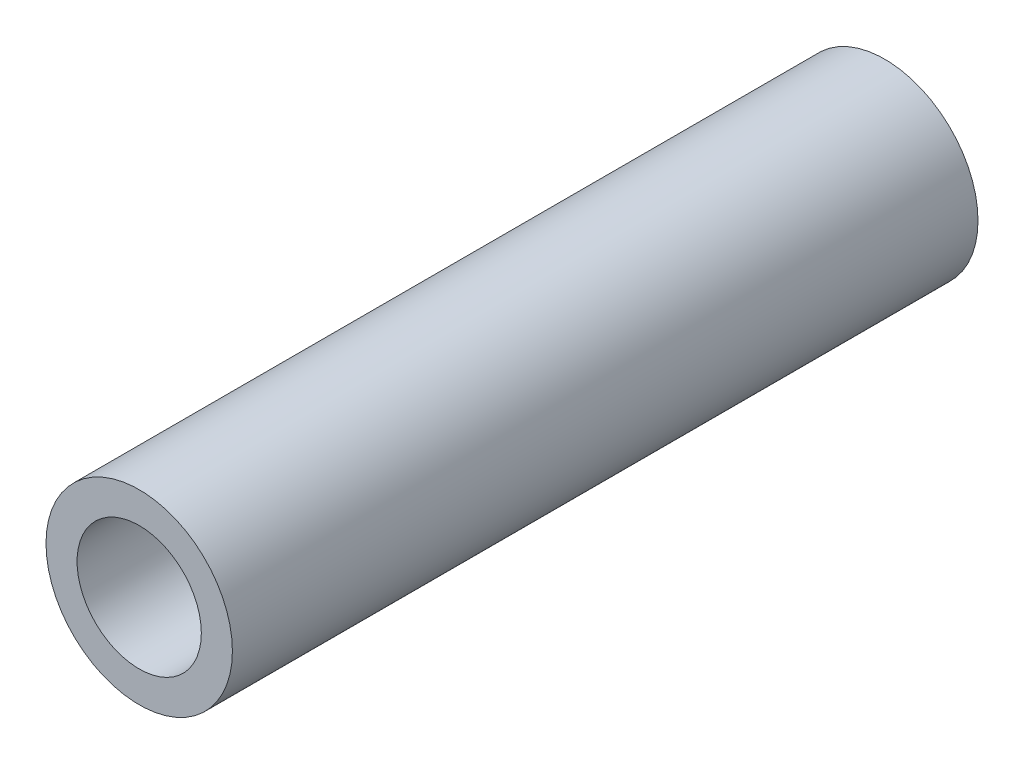
ISO-10303-21;
HEADER;
FILE_DESCRIPTION(('STEP AP214'),'2;1');
FILE_NAME('part.step','',(''),(''),'','','');
FILE_SCHEMA(('AUTOMOTIVE_DESIGN { 1 0 10303 214 1 1 1 1 }'));
ENDSEC;
DATA;
#1=APPLICATION_CONTEXT('core data for automotive mechanical design processes');
#2=APPLICATION_PROTOCOL_DEFINITION('international standard','automotive_design',2000,#1);
#3=PRODUCT_CONTEXT('',#1,'mechanical');
#4=PRODUCT('Part','Part','',(#3));
#5=PRODUCT_RELATED_PRODUCT_CATEGORY('part','',(#4));
#6=PRODUCT_DEFINITION_FORMATION('','',#4);
#7=PRODUCT_DEFINITION_CONTEXT('part definition',#1,'design');
#8=PRODUCT_DEFINITION('design','',#6,#7);
#9=PRODUCT_DEFINITION_SHAPE('','',#8);
#10=(LENGTH_UNIT() NAMED_UNIT(*) SI_UNIT(.MILLI.,.METRE.));
#11=(NAMED_UNIT(*) PLANE_ANGLE_UNIT() SI_UNIT($,.RADIAN.));
#12=(NAMED_UNIT(*) SI_UNIT($,.STERADIAN.) SOLID_ANGLE_UNIT());
#13=UNCERTAINTY_MEASURE_WITH_UNIT(LENGTH_MEASURE(1.E-05),#10,'distance_accuracy_value','');
#14=(GEOMETRIC_REPRESENTATION_CONTEXT(3) GLOBAL_UNCERTAINTY_ASSIGNED_CONTEXT((#13)) GLOBAL_UNIT_ASSIGNED_CONTEXT((#10,
#11,#12)) REPRESENTATION_CONTEXT('',''));
#15=CARTESIAN_POINT('',(0.,0.,0.));
#16=DIRECTION('',(0.,0.,1.));
#17=DIRECTION('',(1.,0.,0.));
#18=AXIS2_PLACEMENT_3D('',#15,#16,#17);
#19=CARTESIAN_POINT('',(0.,0.,-304.8));
#20=DIRECTION('',(0.,0.,1.));
#21=DIRECTION('',(1.,0.,0.));
#22=AXIS2_PLACEMENT_3D('',#19,#20,#21);
#23=CYLINDRICAL_SURFACE('',#22,38.1);
#24=CARTESIAN_POINT('',(0.,0.,-304.8));
#25=DIRECTION('',(0.,0.,1.));
#26=DIRECTION('',(1.,0.,0.));
#27=AXIS2_PLACEMENT_3D('',#24,#25,#26);
#28=CIRCLE('',#27,38.1);
#29=CARTESIAN_POINT('',(38.1,0.,-304.8));
#30=VERTEX_POINT('',#29);
#31=EDGE_CURVE('E10',#30,#30,#28,.T.);
#32=CARTESIAN_POINT('',(0.,0.,0.));
#33=DIRECTION('',(0.,0.,1.));
#34=DIRECTION('',(1.,0.,0.));
#35=AXIS2_PLACEMENT_3D('',#32,#33,#34);
#36=CIRCLE('',#35,38.1);
#37=CARTESIAN_POINT('',(38.1,0.,0.));
#38=VERTEX_POINT('',#37);
#39=EDGE_CURVE('E42',#38,#38,#36,.T.);
#40=CARTESIAN_POINT('',(38.1,0.,-304.8));
#41=CARTESIAN_POINT('',(38.1,0.,-301.625));
#42=CARTESIAN_POINT('',(38.1,0.,-298.45));
#43=CARTESIAN_POINT('',(38.1,0.,-292.1));
#44=CARTESIAN_POINT('',(38.1,0.,-288.925));
#45=CARTESIAN_POINT('',(38.1,0.,-282.575));
#46=CARTESIAN_POINT('',(38.1,0.,-279.4));
#47=CARTESIAN_POINT('',(38.1,0.,-273.05));
#48=CARTESIAN_POINT('',(38.1,0.,-269.875));
#49=CARTESIAN_POINT('',(38.1,0.,-263.525));
#50=CARTESIAN_POINT('',(38.1,0.,-260.35));
#51=CARTESIAN_POINT('',(38.1,0.,-254.));
#52=CARTESIAN_POINT('',(38.1,0.,-250.825));
#53=CARTESIAN_POINT('',(38.1,0.,-244.475));
#54=CARTESIAN_POINT('',(38.1,0.,-241.3));
#55=CARTESIAN_POINT('',(38.1,0.,-234.95));
#56=CARTESIAN_POINT('',(38.1,0.,-231.775));
#57=CARTESIAN_POINT('',(38.1,0.,-225.425));
#58=CARTESIAN_POINT('',(38.1,0.,-222.25));
#59=CARTESIAN_POINT('',(38.1,0.,-215.9));
#60=CARTESIAN_POINT('',(38.1,0.,-212.725));
#61=CARTESIAN_POINT('',(38.1,0.,-206.375));
#62=CARTESIAN_POINT('',(38.1,0.,-203.2));
#63=CARTESIAN_POINT('',(38.1,0.,-196.85));
#64=CARTESIAN_POINT('',(38.1,0.,-193.675));
#65=CARTESIAN_POINT('',(38.1,0.,-187.325));
#66=CARTESIAN_POINT('',(38.1,0.,-184.15));
#67=CARTESIAN_POINT('',(38.1,0.,-177.8));
#68=CARTESIAN_POINT('',(38.1,0.,-174.625));
#69=CARTESIAN_POINT('',(38.1,0.,-168.275));
#70=CARTESIAN_POINT('',(38.1,0.,-165.1));
#71=CARTESIAN_POINT('',(38.1,0.,-158.75));
#72=CARTESIAN_POINT('',(38.1,0.,-155.575));
#73=CARTESIAN_POINT('',(38.1,0.,-149.225));
#74=CARTESIAN_POINT('',(38.1,0.,-146.05));
#75=CARTESIAN_POINT('',(38.1,0.,-139.7));
#76=CARTESIAN_POINT('',(38.1,0.,-136.525));
#77=CARTESIAN_POINT('',(38.1,0.,-130.175));
#78=CARTESIAN_POINT('',(38.1,0.,-127.));
#79=CARTESIAN_POINT('',(38.1,0.,-120.65));
#80=CARTESIAN_POINT('',(38.1,0.,-117.475));
#81=CARTESIAN_POINT('',(38.1,0.,-111.125));
#82=CARTESIAN_POINT('',(38.1,0.,-107.95));
#83=CARTESIAN_POINT('',(38.1,0.,-101.6));
#84=CARTESIAN_POINT('',(38.1,0.,-98.425));
#85=CARTESIAN_POINT('',(38.1,0.,-92.075));
#86=CARTESIAN_POINT('',(38.1,0.,-88.9));
#87=CARTESIAN_POINT('',(38.1,0.,-82.55));
#88=CARTESIAN_POINT('',(38.1,0.,-79.375));
#89=CARTESIAN_POINT('',(38.1,0.,-73.025));
#90=CARTESIAN_POINT('',(38.1,0.,-69.85));
#91=CARTESIAN_POINT('',(38.1,0.,-63.5));
#92=CARTESIAN_POINT('',(38.1,0.,-60.325));
#93=CARTESIAN_POINT('',(38.1,0.,-53.975));
#94=CARTESIAN_POINT('',(38.1,0.,-50.8));
#95=CARTESIAN_POINT('',(38.1,0.,-44.45));
#96=CARTESIAN_POINT('',(38.1,0.,-41.275));
#97=CARTESIAN_POINT('',(38.1,0.,-34.925));
#98=CARTESIAN_POINT('',(38.1,0.,-31.75));
#99=CARTESIAN_POINT('',(38.1,0.,-25.4));
#100=CARTESIAN_POINT('',(38.1,0.,-22.225));
#101=CARTESIAN_POINT('',(38.1,0.,-15.875));
#102=CARTESIAN_POINT('',(38.1,0.,-12.7));
#103=CARTESIAN_POINT('',(38.1,0.,-6.35));
#104=CARTESIAN_POINT('',(38.1,0.,-3.175));
#105=CARTESIAN_POINT('',(38.1,0.,0.));
#106=B_SPLINE_CURVE_WITH_KNOTS('',3,(#40,#41,#42,#43,#44,#45,#46,#47,#48,#49,#50,#51,#52,#53,
#54,#55,#56,#57,#58,#59,#60,#61,#62,#63,#64,#65,#66,#67,#68,#69,#70,#71,#72,#73,#74,#75,#76,#77,
#78,#79,#80,#81,#82,#83,#84,#85,#86,#87,#88,#89,#90,#91,#92,#93,#94,#95,#96,#97,#98,#99,#100,
#101,#102,#103,#104,#105),.UNSPECIFIED.,.F.,.F.,(4,2,2,2,2,2,2,2,2,2,2,2,2,2,2,2,2,2,2,2,2,2,2,
2,2,2,2,2,2,2,2,2,4),(0.,9.52499999999995,19.05,28.575,38.1,47.625,57.15,66.675,76.2,85.725,
95.25,104.775,114.3,123.825,133.35,142.875,152.4,161.925,171.45,180.975,190.5,200.025,209.55,
219.075,228.6,238.125,247.65,257.175,266.7,276.225,285.75,295.275,304.8),.UNSPECIFIED.);
#107=EDGE_CURVE('BSEAM36',#30,#38,#106,.T.);
#108=ORIENTED_EDGE('',*,*,#31,.T.);
#109=ORIENTED_EDGE('',*,*,#39,.F.);
#110=ORIENTED_EDGE('',*,*,#107,.T.);
#111=ORIENTED_EDGE('',*,*,#107,.F.);
#112=EDGE_LOOP('',(#108,#110,#109,#111));
#113=FACE_BOUND('',#112,.T.);
#114=ADVANCED_FACE('F36',(#113),#23,.T.);
#115=CARTESIAN_POINT('',(0.,0.,-304.8));
#116=DIRECTION('',(0.,0.,1.));
#117=DIRECTION('',(1.,0.,0.));
#118=AXIS2_PLACEMENT_3D('',#115,#116,#117);
#119=PLANE('',#118);
#120=CARTESIAN_POINT('',(0.,0.,-304.8));
#121=DIRECTION('',(0.,0.,1.));
#122=DIRECTION('',(1.,0.,0.));
#123=AXIS2_PLACEMENT_3D('',#120,#121,#122);
#124=CIRCLE('',#123,25.4);
#125=CARTESIAN_POINT('',(25.4,0.,-304.8));
#126=VERTEX_POINT('',#125);
#127=EDGE_CURVE('E46',#126,#126,#124,.T.);
#128=ORIENTED_EDGE('',*,*,#127,.T.);
#129=EDGE_LOOP('',(#128));
#130=FACE_BOUND('',#129,.T.);
#131=ORIENTED_EDGE('',*,*,#31,.F.);
#132=EDGE_LOOP('',(#131));
#133=FACE_BOUND('',#132,.T.);
#134=ADVANCED_FACE('F60',(#130,#133),#119,.F.);
#135=CARTESIAN_POINT('',(0.,0.,0.));
#136=DIRECTION('',(0.,0.,1.));
#137=DIRECTION('',(1.,0.,0.));
#138=AXIS2_PLACEMENT_3D('',#135,#136,#137);
#139=PLANE('',#138);
#140=CARTESIAN_POINT('',(0.,0.,0.));
#141=DIRECTION('',(0.,0.,1.));
#142=DIRECTION('',(1.,0.,0.));
#143=AXIS2_PLACEMENT_3D('',#140,#141,#142);
#144=CIRCLE('',#143,25.4);
#145=CARTESIAN_POINT('',(25.4,0.,0.));
#146=VERTEX_POINT('',#145);
#147=EDGE_CURVE('E50',#146,#146,#144,.T.);
#148=ORIENTED_EDGE('',*,*,#147,.F.);
#149=EDGE_LOOP('',(#148));
#150=FACE_BOUND('',#149,.T.);
#151=ORIENTED_EDGE('',*,*,#39,.T.);
#152=EDGE_LOOP('',(#151));
#153=FACE_BOUND('',#152,.T.);
#154=ADVANCED_FACE('F58',(#150,#153),#139,.T.);
#155=CARTESIAN_POINT('',(0.,0.,-304.8));
#156=DIRECTION('',(0.,0.,1.));
#157=DIRECTION('',(1.,0.,0.));
#158=AXIS2_PLACEMENT_3D('',#155,#156,#157);
#159=CYLINDRICAL_SURFACE('',#158,25.4);
#160=CARTESIAN_POINT('',(25.4,0.,-304.8));
#161=CARTESIAN_POINT('',(25.4,0.,-301.625));
#162=CARTESIAN_POINT('',(25.4,0.,-298.45));
#163=CARTESIAN_POINT('',(25.4,0.,-292.1));
#164=CARTESIAN_POINT('',(25.4,0.,-288.925));
#165=CARTESIAN_POINT('',(25.4,0.,-282.575));
#166=CARTESIAN_POINT('',(25.4,0.,-279.4));
#167=CARTESIAN_POINT('',(25.4,0.,-273.05));
#168=CARTESIAN_POINT('',(25.4,0.,-269.875));
#169=CARTESIAN_POINT('',(25.4,0.,-263.525));
#170=CARTESIAN_POINT('',(25.4,0.,-260.35));
#171=CARTESIAN_POINT('',(25.4,0.,-254.));
#172=CARTESIAN_POINT('',(25.4,0.,-250.825));
#173=CARTESIAN_POINT('',(25.4,0.,-244.475));
#174=CARTESIAN_POINT('',(25.4,0.,-241.3));
#175=CARTESIAN_POINT('',(25.4,0.,-234.95));
#176=CARTESIAN_POINT('',(25.4,0.,-231.775));
#177=CARTESIAN_POINT('',(25.4,0.,-225.425));
#178=CARTESIAN_POINT('',(25.4,0.,-222.25));
#179=CARTESIAN_POINT('',(25.4,0.,-215.9));
#180=CARTESIAN_POINT('',(25.4,0.,-212.725));
#181=CARTESIAN_POINT('',(25.4,0.,-206.375));
#182=CARTESIAN_POINT('',(25.4,0.,-203.2));
#183=CARTESIAN_POINT('',(25.4,0.,-196.85));
#184=CARTESIAN_POINT('',(25.4,0.,-193.675));
#185=CARTESIAN_POINT('',(25.4,0.,-187.325));
#186=CARTESIAN_POINT('',(25.4,0.,-184.15));
#187=CARTESIAN_POINT('',(25.4,0.,-177.8));
#188=CARTESIAN_POINT('',(25.4,0.,-174.625));
#189=CARTESIAN_POINT('',(25.4,0.,-168.275));
#190=CARTESIAN_POINT('',(25.4,0.,-165.1));
#191=CARTESIAN_POINT('',(25.4,0.,-158.75));
#192=CARTESIAN_POINT('',(25.4,0.,-155.575));
#193=CARTESIAN_POINT('',(25.4,0.,-149.225));
#194=CARTESIAN_POINT('',(25.4,0.,-146.05));
#195=CARTESIAN_POINT('',(25.4,0.,-139.7));
#196=CARTESIAN_POINT('',(25.4,0.,-136.525));
#197=CARTESIAN_POINT('',(25.4,0.,-130.175));
#198=CARTESIAN_POINT('',(25.4,0.,-127.));
#199=CARTESIAN_POINT('',(25.4,0.,-120.65));
#200=CARTESIAN_POINT('',(25.4,0.,-117.475));
#201=CARTESIAN_POINT('',(25.4,0.,-111.125));
#202=CARTESIAN_POINT('',(25.4,0.,-107.95));
#203=CARTESIAN_POINT('',(25.4,0.,-101.6));
#204=CARTESIAN_POINT('',(25.4,0.,-98.425));
#205=CARTESIAN_POINT('',(25.4,0.,-92.075));
#206=CARTESIAN_POINT('',(25.4,0.,-88.9));
#207=CARTESIAN_POINT('',(25.4,0.,-82.55));
#208=CARTESIAN_POINT('',(25.4,0.,-79.375));
#209=CARTESIAN_POINT('',(25.4,0.,-73.025));
#210=CARTESIAN_POINT('',(25.4,0.,-69.85));
#211=CARTESIAN_POINT('',(25.4,0.,-63.5));
#212=CARTESIAN_POINT('',(25.4,0.,-60.325));
#213=CARTESIAN_POINT('',(25.4,0.,-53.975));
#214=CARTESIAN_POINT('',(25.4,0.,-50.8));
#215=CARTESIAN_POINT('',(25.4,0.,-44.45));
#216=CARTESIAN_POINT('',(25.4,0.,-41.275));
#217=CARTESIAN_POINT('',(25.4,0.,-34.925));
#218=CARTESIAN_POINT('',(25.4,0.,-31.75));
#219=CARTESIAN_POINT('',(25.4,0.,-25.4));
#220=CARTESIAN_POINT('',(25.4,0.,-22.225));
#221=CARTESIAN_POINT('',(25.4,0.,-15.875));
#222=CARTESIAN_POINT('',(25.4,0.,-12.7));
#223=CARTESIAN_POINT('',(25.4,0.,-6.35));
#224=CARTESIAN_POINT('',(25.4,0.,-3.175));
#225=CARTESIAN_POINT('',(25.4,0.,0.));
#226=B_SPLINE_CURVE_WITH_KNOTS('',3,(#160,#161,#162,#163,#164,#165,#166,#167,#168,#169,#170,
#171,#172,#173,#174,#175,#176,#177,#178,#179,#180,#181,#182,#183,#184,#185,#186,#187,#188,#189,
#190,#191,#192,#193,#194,#195,#196,#197,#198,#199,#200,#201,#202,#203,#204,#205,#206,#207,#208,
#209,#210,#211,#212,#213,#214,#215,#216,#217,#218,#219,#220,#221,#222,#223,#224,#225),
.UNSPECIFIED.,.F.,.F.,(4,2,2,2,2,2,2,2,2,2,2,2,2,2,2,2,2,2,2,2,2,2,2,2,2,2,2,2,2,2,2,2,4),(0.,
9.52500000000001,19.05,28.575,38.1,47.625,57.15,66.675,76.2,85.7250000000001,95.2500000000001,
104.775,114.3,123.825,133.35,142.875,152.4,161.925,171.45,180.975,190.5,200.025,209.55,219.075,
228.6,238.125,247.65,257.175,266.7,276.225,285.75,295.275,304.8),.UNSPECIFIED.);
#227=EDGE_CURVE('BSEAM56',#126,#146,#226,.T.);
#228=ORIENTED_EDGE('',*,*,#127,.F.);
#229=ORIENTED_EDGE('',*,*,#147,.T.);
#230=ORIENTED_EDGE('',*,*,#227,.T.);
#231=ORIENTED_EDGE('',*,*,#227,.F.);
#232=EDGE_LOOP('',(#228,#230,#229,#231));
#233=FACE_BOUND('',#232,.T.);
#234=ADVANCED_FACE('F56',(#233),#159,.F.);
#235=CLOSED_SHELL('',(#114,#134,#154,#234));
#236=MANIFOLD_SOLID_BREP('B2',#235);
#237=ADVANCED_BREP_SHAPE_REPRESENTATION('',(#18,#236),#14);
#238=SHAPE_DEFINITION_REPRESENTATION(#9,#237);
ENDSEC;
END-ISO-10303-21;
